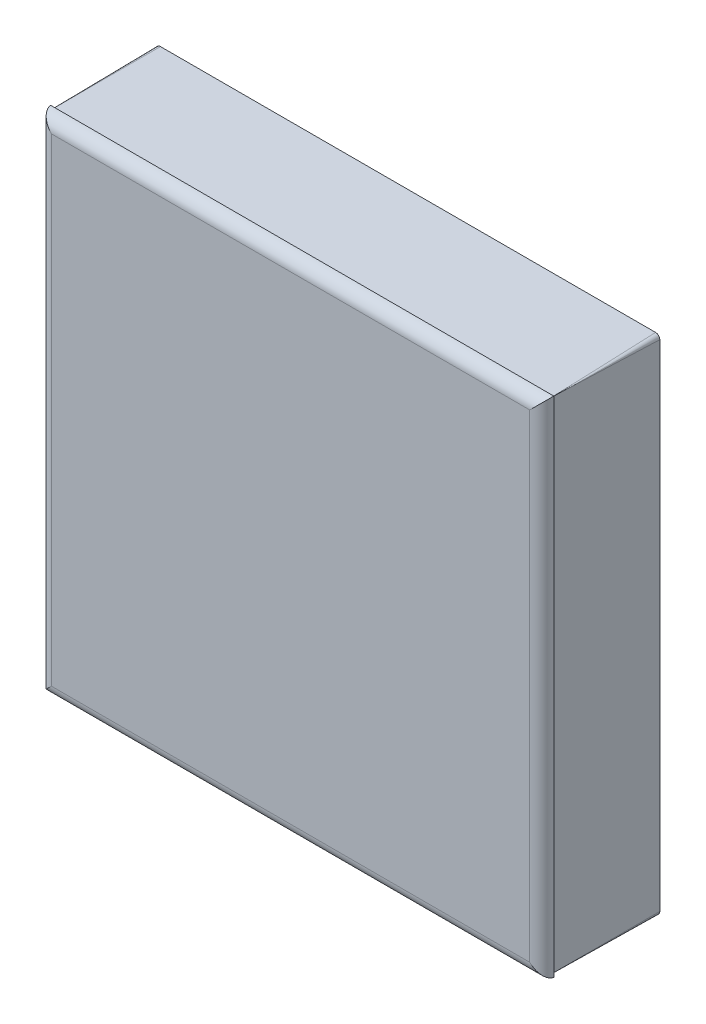
ISO-10303-21;
HEADER;
FILE_DESCRIPTION(('STEP AP214'),'2;1');
FILE_NAME('part.step','',(''),(''),'','','');
FILE_SCHEMA(('AUTOMOTIVE_DESIGN { 1 0 10303 214 1 1 1 1 }'));
ENDSEC;
DATA;
#1=APPLICATION_CONTEXT('core data for automotive mechanical design processes');
#2=APPLICATION_PROTOCOL_DEFINITION('international standard','automotive_design',2000,#1);
#3=PRODUCT_CONTEXT('',#1,'mechanical');
#4=PRODUCT('Part','Part','',(#3));
#5=PRODUCT_RELATED_PRODUCT_CATEGORY('part','',(#4));
#6=PRODUCT_DEFINITION_FORMATION('','',#4);
#7=PRODUCT_DEFINITION_CONTEXT('part definition',#1,'design');
#8=PRODUCT_DEFINITION('design','',#6,#7);
#9=PRODUCT_DEFINITION_SHAPE('','',#8);
#10=(LENGTH_UNIT() NAMED_UNIT(*) SI_UNIT(.MILLI.,.METRE.));
#11=(NAMED_UNIT(*) PLANE_ANGLE_UNIT() SI_UNIT($,.RADIAN.));
#12=(NAMED_UNIT(*) SI_UNIT($,.STERADIAN.) SOLID_ANGLE_UNIT());
#13=UNCERTAINTY_MEASURE_WITH_UNIT(LENGTH_MEASURE(1.E-05),#10,'distance_accuracy_value','');
#14=(GEOMETRIC_REPRESENTATION_CONTEXT(3) GLOBAL_UNCERTAINTY_ASSIGNED_CONTEXT((#13)) GLOBAL_UNIT_ASSIGNED_CONTEXT((#10,
#11,#12)) REPRESENTATION_CONTEXT('',''));
#15=CARTESIAN_POINT('',(0.,0.,0.));
#16=DIRECTION('',(0.,0.,1.));
#17=DIRECTION('',(1.,0.,0.));
#18=AXIS2_PLACEMENT_3D('',#15,#16,#17);
#19=CARTESIAN_POINT('',(-74.7791182383991,-3.54365924382935,4.9619873554947));
#20=DIRECTION('',(4.96635298397137E-05,8.73640615914502E-08,0.999999998766763));
#21=DIRECTION('',(0.00175911633143453,-0.999998452753669,0.));
#22=AXIS2_PLACEMENT_3D('',#19,#20,#21);
#23=PLANE('',#22);
#24=DIRECTION('',(2.27536411647727E-06,0.999999999997408,-8.74770643127985E-08));
#25=VECTOR('',#24,1.);
#26=CARTESIAN_POINT('',(-74.1791182391406,-3.54366060905043,4.96195755737692));
#27=LINE('',#26,#25);
#28=CARTESIAN_POINT('',(-74.1791195929822,-4.13866060904888,4.96195760942577));
#29=VERTEX_POINT('',#28);
#30=CARTESIAN_POINT('',(-74.1791182505174,-3.54866060905041,4.9619575578143));
#31=VERTEX_POINT('',#30);
#32=EDGE_CURVE('E70',#29,#31,#27,.T.);
#33=ORIENTED_EDGE('',*,*,#32,.F.);
#34=CARTESIAN_POINT('',(-74.184119592976,-4.13866059767204,4.96195785774342));
#35=DIRECTION('',(4.96635298397137E-05,8.73640615914502E-08,0.999999998766763));
#36=DIRECTION('',(0.999999998764178,-2.27536843533627E-06,-4.96635296407999E-05));
#37=AXIS2_PLACEMENT_3D('',#34,#35,#36);
#38=CIRCLE('',#37,0.00499999999999461);
#39=CARTESIAN_POINT('',(-74.1841196043529,-4.14366059767203,4.9619578581808));
#40=VERTEX_POINT('',#39);
#41=EDGE_CURVE('E63',#40,#29,#38,.T.);
#42=ORIENTED_EDGE('',*,*,#41,.F.);
#43=DIRECTION('',(0.999999998764178,-2.275368458091E-06,-4.96635296407999E-05));
#44=VECTOR('',#43,1.);
#45=CARTESIAN_POINT('',(-74.7791196036176,-4.1436592438278,4.96198740798094));
#46=LINE('',#45,#44);
#47=CARTESIAN_POINT('',(-74.7741196036237,-4.14365925520464,4.96198715966329));
#48=VERTEX_POINT('',#47);
#49=EDGE_CURVE('E67',#48,#40,#46,.T.);
#50=ORIENTED_EDGE('',*,*,#49,.F.);
#51=CARTESIAN_POINT('',(-74.7741195922469,-4.13865925520465,4.96198715922591));
#52=DIRECTION('',(4.96635298397137E-05,8.73640615914502E-08,0.999999998766763));
#53=DIRECTION('',(0.999999998764178,-2.27536843533627E-06,-4.96635296407999E-05));
#54=AXIS2_PLACEMENT_3D('',#51,#52,#53);
#55=CIRCLE('',#54,0.00499999999999461);
#56=CARTESIAN_POINT('',(-74.7791195922407,-4.13865924382781,4.96198740754356));
#57=VERTEX_POINT('',#56);
#58=EDGE_CURVE('E95',#57,#48,#55,.T.);
#59=ORIENTED_EDGE('',*,*,#58,.F.);
#60=DIRECTION('',(-2.27536411647727E-06,-0.999999999997408,8.74770643127985E-08));
#61=VECTOR('',#60,1.);
#62=CARTESIAN_POINT('',(-74.7791182383991,-3.54365924382935,4.9619873554947));
#63=LINE('',#62,#61);
#64=CARTESIAN_POINT('',(-74.7791182497759,-3.54865924382934,4.96198735593209));
#65=VERTEX_POINT('',#64);
#66=EDGE_CURVE('E127',#65,#57,#63,.T.);
#67=ORIENTED_EDGE('',*,*,#66,.F.);
#68=CARTESIAN_POINT('',(-74.7741182497821,-3.54865925520618,4.96198710761444));
#69=DIRECTION('',(4.96635298397137E-05,8.73640615914502E-08,0.999999998766763));
#70=DIRECTION('',(0.999999998764178,-2.27536843533627E-06,-4.96635296407999E-05));
#71=AXIS2_PLACEMENT_3D('',#68,#69,#70);
#72=CIRCLE('',#71,0.00499999999999461);
#73=CARTESIAN_POINT('',(-74.7741182384053,-3.54365925520619,4.96198710717705));
#74=VERTEX_POINT('',#73);
#75=EDGE_CURVE('E121',#74,#65,#72,.T.);
#76=ORIENTED_EDGE('',*,*,#75,.F.);
#77=DIRECTION('',(-0.999999998764178,2.275368458091E-06,4.96635296407999E-05));
#78=VECTOR('',#77,1.);
#79=CARTESIAN_POINT('',(-74.7791182383991,-3.54365924382935,4.9619873554947));
#80=LINE('',#79,#78);
#81=CARTESIAN_POINT('',(-74.1841182391344,-3.54366059767359,4.96195780569457));
#82=VERTEX_POINT('',#81);
#83=EDGE_CURVE('E115',#82,#74,#80,.T.);
#84=ORIENTED_EDGE('',*,*,#83,.F.);
#85=CARTESIAN_POINT('',(-74.1841182505112,-3.54866059767357,4.96195780613195));
#86=DIRECTION('',(4.96635298397137E-05,8.73640615914502E-08,0.999999998766763));
#87=DIRECTION('',(0.999999998764178,-2.27536843533627E-06,-4.96635296407999E-05));
#88=AXIS2_PLACEMENT_3D('',#85,#86,#87);
#89=CIRCLE('',#88,0.00499999999999461);
#90=EDGE_CURVE('E11',#31,#82,#89,.T.);
#91=ORIENTED_EDGE('',*,*,#90,.F.);
#92=EDGE_LOOP('',(#33,#42,#50,#59,#67,#76,#84,#91));
#93=FACE_BOUND('',#92,.T.);
#94=ADVANCED_FACE('F17',(#93),#23,.F.);
#95=CARTESIAN_POINT('',(-74.1841182505112,-3.54866059767357,4.96195780613195));
#96=DIRECTION('',(4.96635298397137E-05,8.73640615914502E-08,0.999999998766763));
#97=DIRECTION('',(0.999999998764178,-2.27536843533627E-06,-4.96635296407999E-05));
#98=AXIS2_PLACEMENT_3D('',#95,#96,#97);
#99=CYLINDRICAL_SURFACE('',#98,0.00499999999999461);
#100=DIRECTION('',(-4.96635298397137E-05,-8.73640615914501E-08,-0.999999998766763));
#101=VECTOR('',#100,1.);
#102=CARTESIAN_POINT('',(-74.1791182505174,-3.54866060905041,4.9619575578143));
#103=LINE('',#102,#101);
#104=CARTESIAN_POINT('',(-74.1816120368847,-3.54616059244149,5.08695768160028));
#105=VERTEX_POINT('',#104);
#106=EDGE_CURVE('E28',#105,#31,#103,.T.);
#107=ORIENTED_EDGE('',*,*,#106,.T.);
#108=ORIENTED_EDGE('',*,*,#90,.T.);
#109=DIRECTION('',(4.96635298397137E-05,8.73640615914501E-08,0.999999998766763));
#110=VECTOR('',#109,1.);
#111=CARTESIAN_POINT('',(-74.1841182391344,-3.54366059767359,4.96195780569457));
#112=LINE('',#111,#110);
#113=EDGE_CURVE('E126',#82,#105,#112,.T.);
#114=ORIENTED_EDGE('',*,*,#113,.T.);
#115=EDGE_LOOP('',(#107,#108,#114));
#116=FACE_BOUND('',#115,.T.);
#117=ADVANCED_FACE('F253',(#116),#99,.T.);
#118=CARTESIAN_POINT('',(-74.1791182391406,-3.54366060905043,4.96195755737692));
#119=DIRECTION('',(0.999999998764178,-2.275368458091E-06,-4.96635296407999E-05));
#120=DIRECTION('',(0.,-0.998952111073725,0.0457676717929701));
#121=AXIS2_PLACEMENT_3D('',#118,#119,#120);
#122=PLANE('',#121);
#123=ORIENTED_EDGE('',*,*,#32,.T.);
#124=ORIENTED_EDGE('',*,*,#106,.F.);
#125=DIRECTION('',(-2.27536411647727E-06,-0.999999999997408,8.74770643127985E-08));
#126=VECTOR('',#125,1.);
#127=CARTESIAN_POINT('',(-74.1791120311994,-3.54366059812992,5.08695755722276));
#128=LINE('',#127,#126);
#129=CARTESIAN_POINT('',(-74.1816133907263,-4.14116059243995,5.08695773364913));
#130=VERTEX_POINT('',#129);
#131=EDGE_CURVE('E119',#105,#130,#128,.T.);
#132=ORIENTED_EDGE('',*,*,#131,.T.);
#133=DIRECTION('',(-4.96635298397137E-05,-8.73640615914501E-08,-0.999999998766763));
#134=VECTOR('',#133,1.);
#135=CARTESIAN_POINT('',(-74.1791195929822,-4.13866060904888,4.96195760942577));
#136=LINE('',#135,#134);
#137=EDGE_CURVE('E75',#130,#29,#136,.T.);
#138=ORIENTED_EDGE('',*,*,#137,.T.);
#139=EDGE_LOOP('',(#123,#124,#132,#138));
#140=FACE_BOUND('',#139,.T.);
#141=ADVANCED_FACE('F19',(#140),#122,.T.);
#142=CARTESIAN_POINT('',(-74.184119592976,-4.13866059767204,4.96195785774342));
#143=DIRECTION('',(4.96635298397137E-05,8.73640615914502E-08,0.999999998766763));
#144=DIRECTION('',(0.999999998764178,-2.27536843533627E-06,-4.96635296407999E-05));
#145=AXIS2_PLACEMENT_3D('',#142,#143,#144);
#146=CYLINDRICAL_SURFACE('',#145,0.00499999999999461);
#147=DIRECTION('',(-4.96635298397137E-05,-8.73640615914501E-08,-0.999999998766763));
#148=VECTOR('',#147,1.);
#149=CARTESIAN_POINT('',(-74.1841196043529,-4.14366059767203,4.9619578581808));
#150=LINE('',#149,#148);
#151=EDGE_CURVE('E76',#130,#40,#150,.T.);
#152=ORIENTED_EDGE('',*,*,#151,.T.);
#153=ORIENTED_EDGE('',*,*,#41,.T.);
#154=ORIENTED_EDGE('',*,*,#137,.F.);
#155=EDGE_LOOP('',(#152,#153,#154));
#156=FACE_BOUND('',#155,.T.);
#157=ADVANCED_FACE('F79',(#156),#146,.T.);
#158=CARTESIAN_POINT('',(-74.179119604359,-4.14366060904887,4.96195760986316));
#159=DIRECTION('',(-2.27536411647727E-06,-0.999999999997407,8.74770643127984E-08));
#160=DIRECTION('',(-0.999999999997411,2.27536411647728E-06,0.));
#161=AXIS2_PLACEMENT_3D('',#158,#159,#160);
#162=PLANE('',#161);
#163=ORIENTED_EDGE('',*,*,#49,.T.);
#164=ORIENTED_EDGE('',*,*,#151,.F.);
#165=DIRECTION('',(-0.999999998764178,2.275368458091E-06,4.96635296407999E-05));
#166=VECTOR('',#165,1.);
#167=CARTESIAN_POINT('',(-74.1791133964178,-4.14366059812836,5.086957609709));
#168=LINE('',#167,#166);
#169=CARTESIAN_POINT('',(-74.776613389991,-4.14115923859572,5.08698728344927));
#170=VERTEX_POINT('',#169);
#171=EDGE_CURVE('E171',#130,#170,#168,.T.);
#172=ORIENTED_EDGE('',*,*,#171,.T.);
#173=DIRECTION('',(-4.96635298397137E-05,-8.73640615914501E-08,-0.999999998766763));
#174=VECTOR('',#173,1.);
#175=CARTESIAN_POINT('',(-74.7741196036237,-4.14365925520464,4.96198715966329));
#176=LINE('',#175,#174);
#177=EDGE_CURVE('E87',#170,#48,#176,.T.);
#178=ORIENTED_EDGE('',*,*,#177,.T.);
#179=EDGE_LOOP('',(#163,#164,#172,#178));
#180=FACE_BOUND('',#179,.T.);
#181=ADVANCED_FACE('F85',(#180),#162,.T.);
#182=CARTESIAN_POINT('',(-74.7741195922469,-4.13865925520465,4.96198715922591));
#183=DIRECTION('',(4.96635298397137E-05,8.73640615914502E-08,0.999999998766763));
#184=DIRECTION('',(0.999999998764178,-2.27536843533627E-06,-4.96635296407999E-05));
#185=AXIS2_PLACEMENT_3D('',#182,#183,#184);
#186=CYLINDRICAL_SURFACE('',#185,0.00499999999999461);
#187=DIRECTION('',(-4.96635298397137E-05,-8.73640615914501E-08,-0.999999998766763));
#188=VECTOR('',#187,1.);
#189=CARTESIAN_POINT('',(-74.7791195922407,-4.13865924382781,4.96198740754356));
#190=LINE('',#189,#188);
#191=EDGE_CURVE('E131',#170,#57,#190,.T.);
#192=ORIENTED_EDGE('',*,*,#191,.T.);
#193=ORIENTED_EDGE('',*,*,#58,.T.);
#194=ORIENTED_EDGE('',*,*,#177,.F.);
#195=EDGE_LOOP('',(#192,#193,#194));
#196=FACE_BOUND('',#195,.T.);
#197=ADVANCED_FACE('F283',(#196),#186,.T.);
#198=CARTESIAN_POINT('',(-74.7791196036176,-4.1436592438278,4.96198740798094));
#199=DIRECTION('',(-0.999999998764178,2.27536845809101E-06,4.96635296407999E-05));
#200=DIRECTION('',(2.27536846089707E-06,0.999999999997411,0.));
#201=AXIS2_PLACEMENT_3D('',#198,#199,#200);
#202=PLANE('',#201);
#203=ORIENTED_EDGE('',*,*,#66,.T.);
#204=ORIENTED_EDGE('',*,*,#191,.F.);
#205=DIRECTION('',(2.27536411647727E-06,0.999999999997408,-8.74770643127985E-08));
#206=VECTOR('',#205,1.);
#207=CARTESIAN_POINT('',(-74.7791133956763,-4.14365923290729,5.08698740782679));
#208=LINE('',#207,#206);
#209=CARTESIAN_POINT('',(-74.7766120361494,-3.54615923859726,5.08698723140041));
#210=VERTEX_POINT('',#209);
#211=EDGE_CURVE('E189',#170,#210,#208,.T.);
#212=ORIENTED_EDGE('',*,*,#211,.T.);
#213=DIRECTION('',(-4.96635298397137E-05,-8.73640615914501E-08,-0.999999998766763));
#214=VECTOR('',#213,1.);
#215=CARTESIAN_POINT('',(-74.7791182497759,-3.54865924382934,4.96198735593209));
#216=LINE('',#215,#214);
#217=EDGE_CURVE('E125',#210,#65,#216,.T.);
#218=ORIENTED_EDGE('',*,*,#217,.T.);
#219=EDGE_LOOP('',(#203,#204,#212,#218));
#220=FACE_BOUND('',#219,.T.);
#221=ADVANCED_FACE('F287',(#220),#202,.T.);
#222=CARTESIAN_POINT('',(-74.7741182497821,-3.54865925520618,4.96198710761444));
#223=DIRECTION('',(4.96635298397137E-05,8.73640615914502E-08,0.999999998766763));
#224=DIRECTION('',(0.999999998764178,-2.27536843533627E-06,-4.96635296407999E-05));
#225=AXIS2_PLACEMENT_3D('',#222,#223,#224);
#226=CYLINDRICAL_SURFACE('',#225,0.00499999999999461);
#227=DIRECTION('',(-4.96635298397137E-05,-8.73640615914501E-08,-0.999999998766763));
#228=VECTOR('',#227,1.);
#229=CARTESIAN_POINT('',(-74.7741182384053,-3.54365925520619,4.96198710717705));
#230=LINE('',#229,#228);
#231=EDGE_CURVE('E118',#210,#74,#230,.T.);
#232=ORIENTED_EDGE('',*,*,#231,.T.);
#233=ORIENTED_EDGE('',*,*,#75,.T.);
#234=ORIENTED_EDGE('',*,*,#217,.F.);
#235=EDGE_LOOP('',(#232,#233,#234));
#236=FACE_BOUND('',#235,.T.);
#237=ADVANCED_FACE('F292',(#236),#226,.T.);
#238=CARTESIAN_POINT('',(-74.7791182383991,-3.54365924382935,4.9619873554947));
#239=DIRECTION('',(2.27536411647727E-06,0.999999999997407,-8.74770643127985E-08));
#240=DIRECTION('',(-0.0384169232059259,0.,-0.999261797534255));
#241=AXIS2_PLACEMENT_3D('',#238,#239,#240);
#242=PLANE('',#241);
#243=ORIENTED_EDGE('',*,*,#83,.T.);
#244=ORIENTED_EDGE('',*,*,#231,.F.);
#245=DIRECTION('',(0.999999998764178,-2.275368458091E-06,-4.96635296407999E-05));
#246=VECTOR('',#245,1.);
#247=CARTESIAN_POINT('',(-74.7791120304579,-3.54365923290884,5.08698735534055));
#248=LINE('',#247,#246);
#249=EDGE_CURVE('E150',#210,#105,#248,.T.);
#250=ORIENTED_EDGE('',*,*,#249,.T.);
#251=ORIENTED_EDGE('',*,*,#113,.F.);
#252=EDGE_LOOP('',(#243,#244,#250,#251));
#253=FACE_BOUND('',#252,.T.);
#254=ADVANCED_FACE('F231',(#253),#242,.T.);
#255=CARTESIAN_POINT('',(-74.1941120311808,-3.54366056399939,5.08695830217571));
#256=DIRECTION('',(-2.27536411647727E-06,-0.999999999997407,8.74770643127985E-08));
#257=DIRECTION('',(-4.96635297701322E-05,-8.73640615916085E-08,-0.999999998766763));
#258=AXIS2_PLACEMENT_3D('',#255,#256,#257);
#259=CYLINDRICAL_SURFACE('',#258,0.0149999999999997);
#260=DIRECTION('',(-2.27536411647727E-06,-0.999999999997408,8.74770643127985E-08));
#261=VECTOR('',#260,1.);
#262=CARTESIAN_POINT('',(-74.1941112862279,-3.54366056268893,5.10195830215721));
#263=LINE('',#262,#261);
#264=CARTESIAN_POINT('',(-74.1941113203583,-3.55866056268889,5.10195830346936));
#265=VERTEX_POINT('',#264);
#266=CARTESIAN_POINT('',(-74.1941126173159,-4.12866056268742,5.10195835333129));
#267=VERTEX_POINT('',#266);
#268=EDGE_CURVE('E102',#265,#267,#263,.T.);
#269=ORIENTED_EDGE('',*,*,#268,.T.);
#270=CARTESIAN_POINT('',(-74.1941133622688,-4.12866056399787,5.08695835334979));
#271=DIRECTION('',(0.707108389238165,0.707105172256169,-3.51792740442671E-05));
#272=DIRECTION('',(-0.707105171387214,0.70710839011326,3.50555629441214E-05));
#273=AXIS2_PLACEMENT_3D('',#270,#271,#272);
#274=ELLIPSE('',#273,0.0212132034355937,0.0149999999999997);
#275=EDGE_CURVE('E147',#267,#130,#274,.T.);
#276=ORIENTED_EDGE('',*,*,#275,.T.);
#277=ORIENTED_EDGE('',*,*,#131,.F.);
#278=CARTESIAN_POINT('',(-74.1941120653113,-3.55866056399935,5.08695830348786));
#279=DIRECTION('',(0.707105171387114,-0.70710839011336,-3.50555627689812E-05));
#280=DIRECTION('',(0.707108389238265,0.707105172256069,-3.51792742087771E-05));
#281=AXIS2_PLACEMENT_3D('',#278,#279,#280);
#282=ELLIPSE('',#281,0.0212132034356014,0.0149999999999997);
#283=EDGE_CURVE('E114',#105,#265,#282,.T.);
#284=ORIENTED_EDGE('',*,*,#283,.T.);
#285=EDGE_LOOP('',(#269,#276,#277,#284));
#286=FACE_BOUND('',#285,.T.);
#287=ADVANCED_FACE('F257',(#286),#259,.T.);
#288=CARTESIAN_POINT('',(-74.1791133622874,-4.1286605981284,5.08695760839685));
#289=DIRECTION('',(-0.999999998764178,2.27536845809101E-06,4.96635296408E-05));
#290=DIRECTION('',(4.96635298397138E-05,8.73640858728714E-08,0.999999998766763));
#291=AXIS2_PLACEMENT_3D('',#288,#289,#290);
#292=CYLINDRICAL_SURFACE('',#291,0.0149999999999997);
#293=DIRECTION('',(-0.999999998764178,2.275368458091E-06,4.96635296407999E-05));
#294=VECTOR('',#293,1.);
#295=CARTESIAN_POINT('',(-74.1791126173344,-4.12866059681794,5.10195760837835));
#296=LINE('',#295,#294);
#297=CARTESIAN_POINT('',(-74.7641126166115,-4.12865926572739,5.10198666154319));
#298=VERTEX_POINT('',#297);
#299=EDGE_CURVE('E98',#267,#298,#296,.T.);
#300=ORIENTED_EDGE('',*,*,#299,.T.);
#301=CARTESIAN_POINT('',(-74.7641133615644,-4.12865926703785,5.08698666156168));
#302=DIRECTION('',(0.707105171387311,-0.707108390113163,-3.50555627689909E-05));
#303=DIRECTION('',(0.707108389238068,0.707105172256266,-3.51792741628401E-05));
#304=AXIS2_PLACEMENT_3D('',#301,#302,#303);
#305=ELLIPSE('',#304,0.0212132034355966,0.0149999999999997);
#306=EDGE_CURVE('E176',#298,#170,#305,.T.);
#307=ORIENTED_EDGE('',*,*,#306,.T.);
#308=ORIENTED_EDGE('',*,*,#171,.F.);
#309=ORIENTED_EDGE('',*,*,#275,.F.);
#310=EDGE_LOOP('',(#300,#307,#308,#309));
#311=FACE_BOUND('',#310,.T.);
#312=ADVANCED_FACE('F261',(#311),#292,.T.);
#313=CARTESIAN_POINT('',(-74.7641133956949,-4.14365926703782,5.08698666287384));
#314=DIRECTION('',(2.27536411647727E-06,0.999999999997407,-8.74770643127985E-08));
#315=DIRECTION('',(4.96635297701321E-05,8.73640615916085E-08,0.999999998766763));
#316=AXIS2_PLACEMENT_3D('',#313,#314,#315);
#317=CYLINDRICAL_SURFACE('',#316,0.0149999999999997);
#318=DIRECTION('',(2.27536411647727E-06,0.999999999997408,-8.74770643127985E-08));
#319=VECTOR('',#318,1.);
#320=CARTESIAN_POINT('',(-74.7641126507419,-4.14365926572736,5.10198666285534));
#321=LINE('',#320,#319);
#322=CARTESIAN_POINT('',(-74.7641113196539,-3.55865926572887,5.10198661168126));
#323=VERTEX_POINT('',#322);
#324=EDGE_CURVE('E103',#298,#323,#321,.T.);
#325=ORIENTED_EDGE('',*,*,#324,.T.);
#326=CARTESIAN_POINT('',(-74.7641120646069,-3.55865926703933,5.08698661169976));
#327=DIRECTION('',(-0.707108389238165,-0.707105172256169,3.51792740442671E-05));
#328=DIRECTION('',(-0.707105171387214,0.70710839011326,3.50555629645653E-05));
#329=AXIS2_PLACEMENT_3D('',#326,#327,#328);
#330=ELLIPSE('',#329,0.0212132034355937,0.0149999999999997);
#331=EDGE_CURVE('E154',#323,#210,#330,.T.);
#332=ORIENTED_EDGE('',*,*,#331,.T.);
#333=ORIENTED_EDGE('',*,*,#211,.F.);
#334=ORIENTED_EDGE('',*,*,#306,.F.);
#335=EDGE_LOOP('',(#325,#332,#333,#334));
#336=FACE_BOUND('',#335,.T.);
#337=ADVANCED_FACE('F215',(#336),#317,.T.);
#338=CARTESIAN_POINT('',(-74.7791120645883,-3.55865923290881,5.0869873566527));
#339=DIRECTION('',(0.999999998764178,-2.27536845809101E-06,-4.96635296407999E-05));
#340=DIRECTION('',(-4.96635298397137E-05,-8.73640569608135E-08,-0.999999998766763));
#341=AXIS2_PLACEMENT_3D('',#338,#339,#340);
#342=CYLINDRICAL_SURFACE('',#341,0.0149999999999997);
#343=DIRECTION('',(0.999999998764178,-2.275368458091E-06,-4.96635296407999E-05));
#344=VECTOR('',#343,1.);
#345=CARTESIAN_POINT('',(-74.7791113196354,-3.55865923159834,5.10198735663421));
#346=LINE('',#345,#344);
#347=EDGE_CURVE('E104',#323,#265,#346,.T.);
#348=ORIENTED_EDGE('',*,*,#347,.T.);
#349=ORIENTED_EDGE('',*,*,#283,.F.);
#350=ORIENTED_EDGE('',*,*,#249,.F.);
#351=ORIENTED_EDGE('',*,*,#331,.F.);
#352=EDGE_LOOP('',(#348,#349,#350,#351));
#353=FACE_BOUND('',#352,.T.);
#354=ADVANCED_FACE('F227',(#353),#342,.T.);
#355=CARTESIAN_POINT('',(-74.7791112855049,-3.54365923159838,5.10198735532205));
#356=DIRECTION('',(4.96635298397137E-05,8.73640615914502E-08,0.999999998766763));
#357=DIRECTION('',(0.00175911633143453,-0.999998452753669,0.));
#358=AXIS2_PLACEMENT_3D('',#355,#356,#357);
#359=PLANE('',#358);
#360=ORIENTED_EDGE('',*,*,#347,.F.);
#361=ORIENTED_EDGE('',*,*,#324,.F.);
#362=ORIENTED_EDGE('',*,*,#299,.F.);
#363=ORIENTED_EDGE('',*,*,#268,.F.);
#364=EDGE_LOOP('',(#360,#361,#362,#363));
#365=FACE_BOUND('',#364,.T.);
#366=ADVANCED_FACE('F363',(#365),#359,.T.);
#367=CLOSED_SHELL('',(#94,#117,#141,#157,#181,#197,#221,#237,#254,#287,#312,#337,#354,#366));
#368=MANIFOLD_SOLID_BREP('B1',#367);
#369=ADVANCED_BREP_SHAPE_REPRESENTATION('',(#18,#368),#14);
#370=SHAPE_DEFINITION_REPRESENTATION(#9,#369);
ENDSEC;
END-ISO-10303-21;
